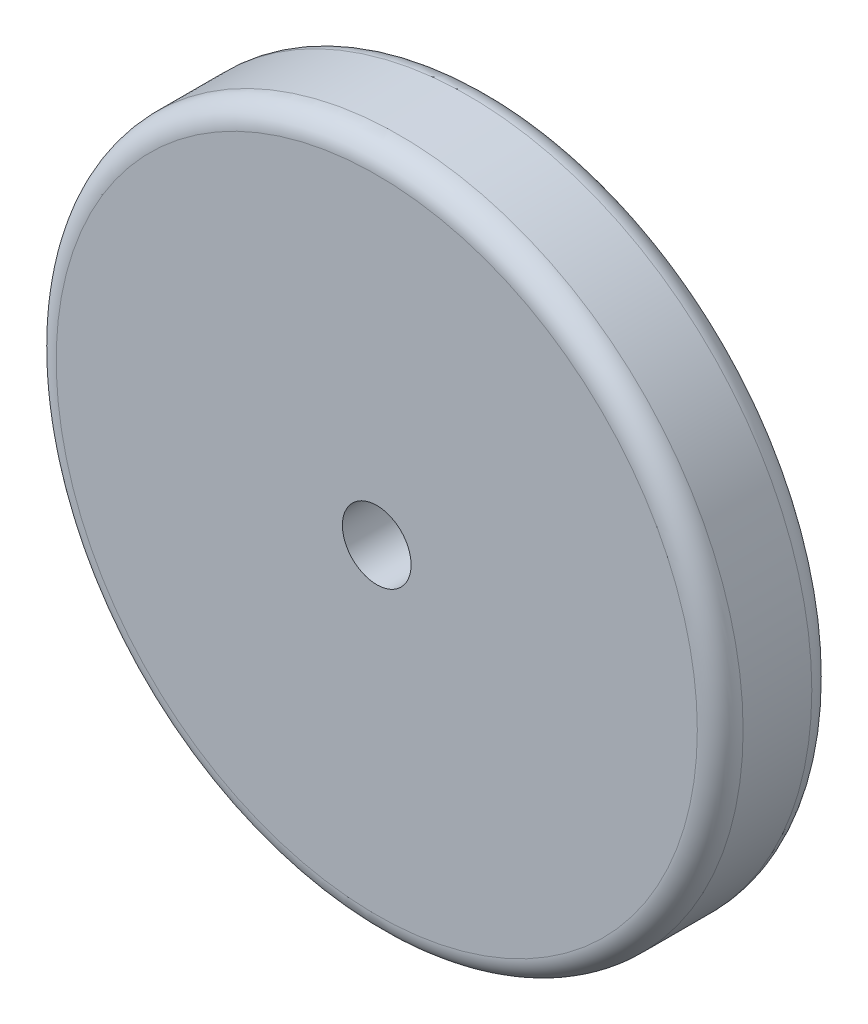
ISO-10303-21;
HEADER;
FILE_DESCRIPTION(('STEP AP214'),'2;1');
FILE_NAME('part.step','',(''),(''),'','','');
FILE_SCHEMA(('AUTOMOTIVE_DESIGN { 1 0 10303 214 1 1 1 1 }'));
ENDSEC;
DATA;
#1=APPLICATION_CONTEXT('core data for automotive mechanical design processes');
#2=APPLICATION_PROTOCOL_DEFINITION('international standard','automotive_design',2000,#1);
#3=PRODUCT_CONTEXT('',#1,'mechanical');
#4=PRODUCT('Part','Part','',(#3));
#5=PRODUCT_RELATED_PRODUCT_CATEGORY('part','',(#4));
#6=PRODUCT_DEFINITION_FORMATION('','',#4);
#7=PRODUCT_DEFINITION_CONTEXT('part definition',#1,'design');
#8=PRODUCT_DEFINITION('design','',#6,#7);
#9=PRODUCT_DEFINITION_SHAPE('','',#8);
#10=(LENGTH_UNIT() NAMED_UNIT(*) SI_UNIT(.MILLI.,.METRE.));
#11=(NAMED_UNIT(*) PLANE_ANGLE_UNIT() SI_UNIT($,.RADIAN.));
#12=(NAMED_UNIT(*) SI_UNIT($,.STERADIAN.) SOLID_ANGLE_UNIT());
#13=UNCERTAINTY_MEASURE_WITH_UNIT(LENGTH_MEASURE(1.E-05),#10,'distance_accuracy_value','');
#14=(GEOMETRIC_REPRESENTATION_CONTEXT(3) GLOBAL_UNCERTAINTY_ASSIGNED_CONTEXT((#13)) GLOBAL_UNIT_ASSIGNED_CONTEXT((#10,
#11,#12)) REPRESENTATION_CONTEXT('',''));
#15=CARTESIAN_POINT('',(0.,0.,0.));
#16=DIRECTION('',(0.,0.,1.));
#17=DIRECTION('',(1.,0.,0.));
#18=AXIS2_PLACEMENT_3D('',#15,#16,#17);
#19=CARTESIAN_POINT('',(0.,0.,2.5));
#20=DIRECTION('',(0.,0.,-1.));
#21=DIRECTION('',(-1.,0.,0.));
#22=AXIS2_PLACEMENT_3D('',#19,#20,#21);
#23=CYLINDRICAL_SURFACE('',#22,7.5);
#24=CARTESIAN_POINT('',(0.,0.,2.));
#25=DIRECTION('',(0.,0.,1.));
#26=DIRECTION('',(1.,0.,0.));
#27=AXIS2_PLACEMENT_3D('',#24,#25,#26);
#28=CIRCLE('',#27,7.5);
#29=CARTESIAN_POINT('',(7.5,0.,2.));
#30=VERTEX_POINT('',#29);
#31=EDGE_CURVE('E41',#30,#30,#28,.F.);
#32=ORIENTED_EDGE('',*,*,#31,.T.);
#33=EDGE_LOOP('',(#32));
#34=FACE_BOUND('',#33,.T.);
#35=CARTESIAN_POINT('',(0.,0.,0.5));
#36=DIRECTION('',(0.,0.,1.));
#37=DIRECTION('',(1.,0.,0.));
#38=AXIS2_PLACEMENT_3D('',#35,#36,#37);
#39=CIRCLE('',#38,7.5);
#40=CARTESIAN_POINT('',(7.5,0.,0.5));
#41=VERTEX_POINT('',#40);
#42=EDGE_CURVE('E45',#41,#41,#39,.T.);
#43=ORIENTED_EDGE('',*,*,#42,.T.);
#44=EDGE_LOOP('',(#43));
#45=FACE_BOUND('',#44,.T.);
#46=ADVANCED_FACE('F34',(#34,#45),#23,.T.);
#47=CARTESIAN_POINT('',(0.,0.,2.5));
#48=DIRECTION('',(0.,0.,1.));
#49=DIRECTION('',(1.,0.,0.));
#50=AXIS2_PLACEMENT_3D('',#47,#48,#49);
#51=PLANE('',#50);
#52=CARTESIAN_POINT('',(0.,0.,2.5));
#53=DIRECTION('',(0.,0.,1.));
#54=DIRECTION('',(1.,0.,0.));
#55=AXIS2_PLACEMENT_3D('',#52,#53,#54);
#56=CIRCLE('',#55,7.);
#57=CARTESIAN_POINT('',(7.,0.,2.5));
#58=VERTEX_POINT('',#57);
#59=EDGE_CURVE('E49',#58,#58,#56,.T.);
#60=ORIENTED_EDGE('',*,*,#59,.T.);
#61=EDGE_LOOP('',(#60));
#62=FACE_BOUND('',#61,.T.);
#63=CARTESIAN_POINT('',(0.,0.,2.5));
#64=DIRECTION('',(0.,0.,-1.));
#65=DIRECTION('',(-1.,0.,0.));
#66=AXIS2_PLACEMENT_3D('',#63,#64,#65);
#67=CIRCLE('',#66,0.75);
#68=CARTESIAN_POINT('',(-0.75,0.,2.5));
#69=VERTEX_POINT('',#68);
#70=EDGE_CURVE('E54',#69,#69,#67,.T.);
#71=ORIENTED_EDGE('',*,*,#70,.T.);
#72=EDGE_LOOP('',(#71));
#73=FACE_BOUND('',#72,.T.);
#74=ADVANCED_FACE('F61',(#62,#73),#51,.T.);
#75=CARTESIAN_POINT('',(0.,0.,0.));
#76=DIRECTION('',(0.,0.,1.));
#77=DIRECTION('',(1.,0.,0.));
#78=AXIS2_PLACEMENT_3D('',#75,#76,#77);
#79=PLANE('',#78);
#80=CARTESIAN_POINT('',(0.,0.,0.));
#81=DIRECTION('',(0.,0.,1.));
#82=DIRECTION('',(1.,0.,0.));
#83=AXIS2_PLACEMENT_3D('',#80,#81,#82);
#84=CIRCLE('',#83,7.);
#85=CARTESIAN_POINT('',(7.,0.,0.));
#86=VERTEX_POINT('',#85);
#87=EDGE_CURVE('E10',#86,#86,#84,.F.);
#88=ORIENTED_EDGE('',*,*,#87,.T.);
#89=EDGE_LOOP('',(#88));
#90=FACE_BOUND('',#89,.T.);
#91=CARTESIAN_POINT('',(0.,0.,0.));
#92=DIRECTION('',(0.,0.,-1.));
#93=DIRECTION('',(-1.,0.,0.));
#94=AXIS2_PLACEMENT_3D('',#91,#92,#93);
#95=CIRCLE('',#94,0.75);
#96=CARTESIAN_POINT('',(-0.75,0.,0.));
#97=VERTEX_POINT('',#96);
#98=EDGE_CURVE('E55',#97,#97,#95,.T.);
#99=ORIENTED_EDGE('',*,*,#98,.F.);
#100=EDGE_LOOP('',(#99));
#101=FACE_BOUND('',#100,.T.);
#102=ADVANCED_FACE('F67',(#90,#101),#79,.F.);
#103=CARTESIAN_POINT('',(0.,0.,2.5));
#104=DIRECTION('',(0.,0.,-1.));
#105=DIRECTION('',(-1.,0.,0.));
#106=AXIS2_PLACEMENT_3D('',#103,#104,#105);
#107=CYLINDRICAL_SURFACE('',#106,0.75);
#108=ORIENTED_EDGE('',*,*,#70,.F.);
#109=EDGE_LOOP('',(#108));
#110=FACE_BOUND('',#109,.T.);
#111=ORIENTED_EDGE('',*,*,#98,.T.);
#112=EDGE_LOOP('',(#111));
#113=FACE_BOUND('',#112,.T.);
#114=ADVANCED_FACE('F63',(#110,#113),#107,.F.);
#115=CARTESIAN_POINT('',(0.,0.,2.));
#116=DIRECTION('',(0.,0.,1.));
#117=DIRECTION('',(1.,0.,0.));
#118=AXIS2_PLACEMENT_3D('',#115,#116,#117);
#119=TOROIDAL_SURFACE('',#118,7.,0.5);
#120=ORIENTED_EDGE('',*,*,#31,.F.);
#121=EDGE_LOOP('',(#120));
#122=FACE_BOUND('',#121,.T.);
#123=ORIENTED_EDGE('',*,*,#59,.F.);
#124=EDGE_LOOP('',(#123));
#125=FACE_BOUND('',#124,.T.);
#126=ADVANCED_FACE('F66',(#122,#125),#119,.T.);
#127=CARTESIAN_POINT('',(0.,0.,0.5));
#128=DIRECTION('',(0.,0.,1.));
#129=DIRECTION('',(1.,0.,0.));
#130=AXIS2_PLACEMENT_3D('',#127,#128,#129);
#131=TOROIDAL_SURFACE('',#130,7.,0.5);
#132=ORIENTED_EDGE('',*,*,#87,.F.);
#133=EDGE_LOOP('',(#132));
#134=FACE_BOUND('',#133,.T.);
#135=ORIENTED_EDGE('',*,*,#42,.F.);
#136=EDGE_LOOP('',(#135));
#137=FACE_BOUND('',#136,.T.);
#138=ADVANCED_FACE('F36',(#134,#137),#131,.T.);
#139=CLOSED_SHELL('',(#46,#74,#102,#114,#126,#138));
#140=MANIFOLD_SOLID_BREP('B2',#139);
#141=ADVANCED_BREP_SHAPE_REPRESENTATION('',(#18,#140),#14);
#142=SHAPE_DEFINITION_REPRESENTATION(#9,#141);
ENDSEC;
END-ISO-10303-21;
